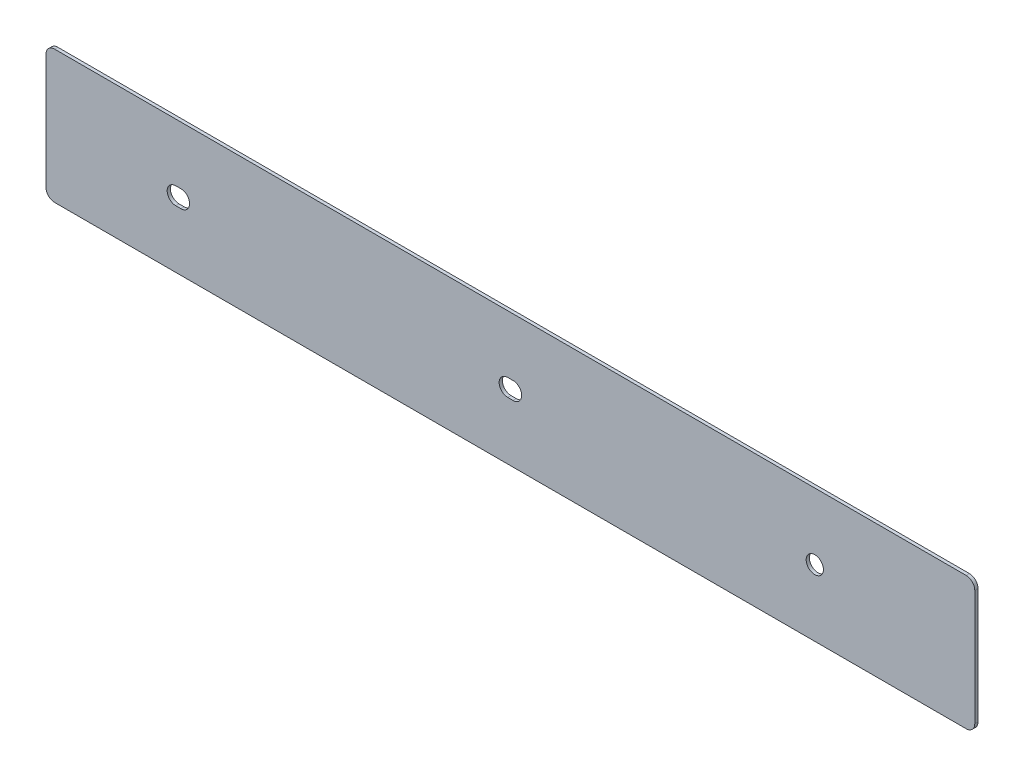
ISO-10303-21;
HEADER;
FILE_DESCRIPTION(('STEP AP214'),'2;1');
FILE_NAME('part.step','',(''),(''),'','','');
FILE_SCHEMA(('AUTOMOTIVE_DESIGN { 1 0 10303 214 1 1 1 1 }'));
ENDSEC;
DATA;
#1=APPLICATION_CONTEXT('core data for automotive mechanical design processes');
#2=APPLICATION_PROTOCOL_DEFINITION('international standard','automotive_design',2000,#1);
#3=PRODUCT_CONTEXT('',#1,'mechanical');
#4=PRODUCT('Part','Part','',(#3));
#5=PRODUCT_RELATED_PRODUCT_CATEGORY('part','',(#4));
#6=PRODUCT_DEFINITION_FORMATION('','',#4);
#7=PRODUCT_DEFINITION_CONTEXT('part definition',#1,'design');
#8=PRODUCT_DEFINITION('design','',#6,#7);
#9=PRODUCT_DEFINITION_SHAPE('','',#8);
#10=(LENGTH_UNIT() NAMED_UNIT(*) SI_UNIT(.MILLI.,.METRE.));
#11=(NAMED_UNIT(*) PLANE_ANGLE_UNIT() SI_UNIT($,.RADIAN.));
#12=(NAMED_UNIT(*) SI_UNIT($,.STERADIAN.) SOLID_ANGLE_UNIT());
#13=UNCERTAINTY_MEASURE_WITH_UNIT(LENGTH_MEASURE(1.E-05),#10,'distance_accuracy_value','');
#14=(GEOMETRIC_REPRESENTATION_CONTEXT(3) GLOBAL_UNCERTAINTY_ASSIGNED_CONTEXT((#13)) GLOBAL_UNIT_ASSIGNED_CONTEXT((#10,
#11,#12)) REPRESENTATION_CONTEXT('',''));
#15=CARTESIAN_POINT('',(0.,0.,0.));
#16=DIRECTION('',(0.,0.,1.));
#17=DIRECTION('',(1.,0.,0.));
#18=AXIS2_PLACEMENT_3D('',#15,#16,#17);
#19=CARTESIAN_POINT('',(0.,0.,-11.92));
#20=DIRECTION('',(0.,0.,1.));
#21=DIRECTION('',(1.,0.,0.));
#22=AXIS2_PLACEMENT_3D('',#19,#20,#21);
#23=PLANE('',#22);
#24=CARTESIAN_POINT('',(-0.3,0.,-11.92));
#25=DIRECTION('',(0.,0.,1.));
#26=DIRECTION('',(1.,0.,0.));
#27=AXIS2_PLACEMENT_3D('',#24,#25,#26);
#28=CIRCLE('',#27,1.);
#29=CARTESIAN_POINT('',(-0.300000000011674,-1.,-11.92));
#30=VERTEX_POINT('',#29);
#31=CARTESIAN_POINT('',(-0.3,1.,-11.92));
#32=VERTEX_POINT('',#31);
#33=EDGE_CURVE('E152',#30,#32,#28,.F.);
#34=ORIENTED_EDGE('',*,*,#33,.T.);
#35=DIRECTION('',(1.,0.,0.));
#36=VECTOR('',#35,1.);
#37=CARTESIAN_POINT('',(-0.3,1.,-11.92));
#38=LINE('',#37,#36);
#39=CARTESIAN_POINT('',(0.426474957438373,1.00000000000013,-11.92));
#40=VERTEX_POINT('',#39);
#41=EDGE_CURVE('E154',#40,#32,#38,.F.);
#42=ORIENTED_EDGE('',*,*,#41,.F.);
#43=CARTESIAN_POINT('',(0.3,0.,-11.92));
#44=DIRECTION('',(0.,0.,1.));
#45=DIRECTION('',(1.,0.,0.));
#46=AXIS2_PLACEMENT_3D('',#43,#44,#45);
#47=CIRCLE('',#46,1.007966227043);
#48=CARTESIAN_POINT('',(0.299999999999996,-1.007966227043,-11.92));
#49=VERTEX_POINT('',#48);
#50=EDGE_CURVE('E156',#40,#49,#47,.F.);
#51=ORIENTED_EDGE('',*,*,#50,.T.);
#52=DIRECTION('',(-0.999911871688358,0.0132758749875694,0.));
#53=VECTOR('',#52,1.);
#54=CARTESIAN_POINT('',(0.3,-1.007966227043,-11.92));
#55=LINE('',#54,#53);
#56=EDGE_CURVE('E149',#30,#49,#55,.F.);
#57=ORIENTED_EDGE('',*,*,#56,.F.);
#58=EDGE_LOOP('',(#34,#42,#51,#57));
#59=FACE_BOUND('',#58,.T.);
#60=CARTESIAN_POINT('',(-38.8,0.,-11.92));
#61=DIRECTION('',(0.,0.,1.));
#62=DIRECTION('',(1.,0.,0.));
#63=AXIS2_PLACEMENT_3D('',#60,#61,#62);
#64=CIRCLE('',#63,1.);
#65=CARTESIAN_POINT('',(-38.8,-1.,-11.92));
#66=VERTEX_POINT('',#65);
#67=CARTESIAN_POINT('',(-38.8,1.,-11.92));
#68=VERTEX_POINT('',#67);
#69=EDGE_CURVE('E161',#66,#68,#64,.F.);
#70=ORIENTED_EDGE('',*,*,#69,.T.);
#71=DIRECTION('',(1.,0.,0.));
#72=VECTOR('',#71,1.);
#73=CARTESIAN_POINT('',(-38.8,1.,-11.92));
#74=LINE('',#73,#72);
#75=CARTESIAN_POINT('',(-38.2,1.,-11.92));
#76=VERTEX_POINT('',#75);
#77=EDGE_CURVE('E163',#76,#68,#74,.F.);
#78=ORIENTED_EDGE('',*,*,#77,.F.);
#79=CARTESIAN_POINT('',(-38.2,0.,-11.92));
#80=DIRECTION('',(0.,0.,1.));
#81=DIRECTION('',(1.,0.,0.));
#82=AXIS2_PLACEMENT_3D('',#79,#80,#81);
#83=CIRCLE('',#82,1.);
#84=CARTESIAN_POINT('',(-38.2,-1.,-11.92));
#85=VERTEX_POINT('',#84);
#86=EDGE_CURVE('E165',#76,#85,#83,.F.);
#87=ORIENTED_EDGE('',*,*,#86,.T.);
#88=DIRECTION('',(1.,0.,0.));
#89=VECTOR('',#88,1.);
#90=CARTESIAN_POINT('',(-38.2,-1.,-11.92));
#91=LINE('',#90,#89);
#92=EDGE_CURVE('E158',#66,#85,#91,.T.);
#93=ORIENTED_EDGE('',*,*,#92,.F.);
#94=EDGE_LOOP('',(#70,#78,#87,#93));
#95=FACE_BOUND('',#94,.T.);
#96=CARTESIAN_POINT('',(35.3,0.,-11.92));
#97=DIRECTION('',(0.,0.,1.));
#98=DIRECTION('',(1.,0.,0.));
#99=AXIS2_PLACEMENT_3D('',#96,#97,#98);
#100=CIRCLE('',#99,1.);
#101=CARTESIAN_POINT('',(36.3,0.,-11.92));
#102=VERTEX_POINT('',#101);
#103=EDGE_CURVE('E166',#102,#102,#100,.F.);
#104=ORIENTED_EDGE('',*,*,#103,.T.);
#105=EDGE_LOOP('',(#104));
#106=FACE_BOUND('',#105,.T.);
#107=DIRECTION('',(0.,1.,0.));
#108=VECTOR('',#107,1.);
#109=CARTESIAN_POINT('',(53.85,-6.7,-11.92));
#110=LINE('',#109,#108);
#111=CARTESIAN_POINT('',(53.85,6.7,-11.92));
#112=VERTEX_POINT('',#111);
#113=CARTESIAN_POINT('',(53.85,-6.7,-11.92));
#114=VERTEX_POINT('',#113);
#115=EDGE_CURVE('E129',#112,#114,#110,.F.);
#116=ORIENTED_EDGE('',*,*,#115,.F.);
#117=CARTESIAN_POINT('',(52.85,6.7,-11.92));
#118=DIRECTION('',(0.,0.,1.));
#119=DIRECTION('',(1.,0.,0.));
#120=AXIS2_PLACEMENT_3D('',#117,#118,#119);
#121=CIRCLE('',#120,1.);
#122=CARTESIAN_POINT('',(52.85,7.7,-11.92));
#123=VERTEX_POINT('',#122);
#124=EDGE_CURVE('E20',#123,#112,#121,.F.);
#125=ORIENTED_EDGE('',*,*,#124,.F.);
#126=DIRECTION('',(1.,0.,0.));
#127=VECTOR('',#126,1.);
#128=CARTESIAN_POINT('',(52.85,7.7,-11.92));
#129=LINE('',#128,#127);
#130=CARTESIAN_POINT('',(-52.85,7.7,-11.92));
#131=VERTEX_POINT('',#130);
#132=EDGE_CURVE('E126',#131,#123,#129,.T.);
#133=ORIENTED_EDGE('',*,*,#132,.F.);
#134=CARTESIAN_POINT('',(-52.85,6.7,-11.92));
#135=DIRECTION('',(0.,0.,1.));
#136=DIRECTION('',(1.,0.,0.));
#137=AXIS2_PLACEMENT_3D('',#134,#135,#136);
#138=CIRCLE('',#137,1.);
#139=CARTESIAN_POINT('',(-53.85,6.7,-11.92));
#140=VERTEX_POINT('',#139);
#141=EDGE_CURVE('E223',#140,#131,#138,.F.);
#142=ORIENTED_EDGE('',*,*,#141,.F.);
#143=DIRECTION('',(0.,1.,0.));
#144=VECTOR('',#143,1.);
#145=CARTESIAN_POINT('',(-53.85,6.7,-11.92));
#146=LINE('',#145,#144);
#147=CARTESIAN_POINT('',(-53.85,-6.7,-11.92));
#148=VERTEX_POINT('',#147);
#149=EDGE_CURVE('E174',#148,#140,#146,.T.);
#150=ORIENTED_EDGE('',*,*,#149,.F.);
#151=CARTESIAN_POINT('',(-52.85,-6.7,-11.92));
#152=DIRECTION('',(0.,0.,1.));
#153=DIRECTION('',(1.,0.,0.));
#154=AXIS2_PLACEMENT_3D('',#151,#152,#153);
#155=CIRCLE('',#154,1.);
#156=CARTESIAN_POINT('',(-52.85,-7.7,-11.92));
#157=VERTEX_POINT('',#156);
#158=EDGE_CURVE('E221',#157,#148,#155,.F.);
#159=ORIENTED_EDGE('',*,*,#158,.F.);
#160=DIRECTION('',(1.,0.,0.));
#161=VECTOR('',#160,1.);
#162=CARTESIAN_POINT('',(-52.85,-7.7,-11.92));
#163=LINE('',#162,#161);
#164=CARTESIAN_POINT('',(52.85,-7.7,-11.92));
#165=VERTEX_POINT('',#164);
#166=EDGE_CURVE('E169',#165,#157,#163,.F.);
#167=ORIENTED_EDGE('',*,*,#166,.F.);
#168=CARTESIAN_POINT('',(52.85,-6.7,-11.92));
#169=DIRECTION('',(0.,0.,1.));
#170=DIRECTION('',(1.,0.,0.));
#171=AXIS2_PLACEMENT_3D('',#168,#169,#170);
#172=CIRCLE('',#171,1.);
#173=EDGE_CURVE('E217',#114,#165,#172,.F.);
#174=ORIENTED_EDGE('',*,*,#173,.F.);
#175=EDGE_LOOP('',(#116,#125,#133,#142,#150,#159,#167,#174));
#176=FACE_BOUND('',#175,.T.);
#177=ADVANCED_FACE('F17',(#59,#95,#106,#176),#23,.T.);
#178=CARTESIAN_POINT('',(52.85,6.7,-11.92));
#179=DIRECTION('',(0.,0.,1.));
#180=DIRECTION('',(1.,0.,0.));
#181=AXIS2_PLACEMENT_3D('',#178,#179,#180);
#182=CYLINDRICAL_SURFACE('',#181,1.);
#183=DIRECTION('',(0.,0.,1.));
#184=VECTOR('',#183,1.);
#185=CARTESIAN_POINT('',(52.85,7.7,-11.92));
#186=LINE('',#185,#184);
#187=CARTESIAN_POINT('',(52.85,7.7,-12.295));
#188=VERTEX_POINT('',#187);
#189=EDGE_CURVE('E134',#123,#188,#186,.F.);
#190=ORIENTED_EDGE('',*,*,#189,.F.);
#191=ORIENTED_EDGE('',*,*,#124,.T.);
#192=DIRECTION('',(0.,0.,-1.));
#193=VECTOR('',#192,1.);
#194=CARTESIAN_POINT('',(53.85,6.7,-11.92));
#195=LINE('',#194,#193);
#196=CARTESIAN_POINT('',(53.85,6.7,-12.295));
#197=VERTEX_POINT('',#196);
#198=EDGE_CURVE('E168',#197,#112,#195,.F.);
#199=ORIENTED_EDGE('',*,*,#198,.F.);
#200=CARTESIAN_POINT('',(52.85,6.7,-12.295));
#201=DIRECTION('',(0.,0.,1.));
#202=DIRECTION('',(1.,0.,0.));
#203=AXIS2_PLACEMENT_3D('',#200,#201,#202);
#204=CIRCLE('',#203,1.);
#205=EDGE_CURVE('E144',#197,#188,#204,.T.);
#206=ORIENTED_EDGE('',*,*,#205,.T.);
#207=EDGE_LOOP('',(#190,#191,#199,#206));
#208=FACE_BOUND('',#207,.T.);
#209=ADVANCED_FACE('F143',(#208),#182,.T.);
#210=CARTESIAN_POINT('',(52.85,7.7,-11.92));
#211=DIRECTION('',(0.,1.,0.));
#212=DIRECTION('',(0.,0.,1.));
#213=AXIS2_PLACEMENT_3D('',#210,#211,#212);
#214=PLANE('',#213);
#215=DIRECTION('',(0.,0.,1.));
#216=VECTOR('',#215,1.);
#217=CARTESIAN_POINT('',(-52.85,7.7,-11.92));
#218=LINE('',#217,#216);
#219=CARTESIAN_POINT('',(-52.85,7.7,-12.295));
#220=VERTEX_POINT('',#219);
#221=EDGE_CURVE('E140',#131,#220,#218,.F.);
#222=ORIENTED_EDGE('',*,*,#221,.F.);
#223=ORIENTED_EDGE('',*,*,#132,.T.);
#224=ORIENTED_EDGE('',*,*,#189,.T.);
#225=DIRECTION('',(1.,0.,0.));
#226=VECTOR('',#225,1.);
#227=CARTESIAN_POINT('',(0.,7.7,-12.295));
#228=LINE('',#227,#226);
#229=EDGE_CURVE('E203',#188,#220,#228,.F.);
#230=ORIENTED_EDGE('',*,*,#229,.T.);
#231=EDGE_LOOP('',(#222,#223,#224,#230));
#232=FACE_BOUND('',#231,.T.);
#233=ADVANCED_FACE('F137',(#232),#214,.T.);
#234=CARTESIAN_POINT('',(-52.85,6.7,-11.92));
#235=DIRECTION('',(0.,0.,1.));
#236=DIRECTION('',(1.,0.,0.));
#237=AXIS2_PLACEMENT_3D('',#234,#235,#236);
#238=CYLINDRICAL_SURFACE('',#237,1.);
#239=DIRECTION('',(0.,0.,1.));
#240=VECTOR('',#239,1.);
#241=CARTESIAN_POINT('',(-53.85,6.7,-11.92));
#242=LINE('',#241,#240);
#243=CARTESIAN_POINT('',(-53.85,6.7,-12.295));
#244=VERTEX_POINT('',#243);
#245=EDGE_CURVE('E177',#140,#244,#242,.F.);
#246=ORIENTED_EDGE('',*,*,#245,.F.);
#247=ORIENTED_EDGE('',*,*,#141,.T.);
#248=ORIENTED_EDGE('',*,*,#221,.T.);
#249=CARTESIAN_POINT('',(-52.85,6.7,-12.295));
#250=DIRECTION('',(0.,0.,1.));
#251=DIRECTION('',(1.,0.,0.));
#252=AXIS2_PLACEMENT_3D('',#249,#250,#251);
#253=CIRCLE('',#252,1.);
#254=EDGE_CURVE('E200',#220,#244,#253,.T.);
#255=ORIENTED_EDGE('',*,*,#254,.T.);
#256=EDGE_LOOP('',(#246,#247,#248,#255));
#257=FACE_BOUND('',#256,.T.);
#258=ADVANCED_FACE('F227',(#257),#238,.T.);
#259=CARTESIAN_POINT('',(-53.85,6.7,-11.92));
#260=DIRECTION('',(-1.,0.,0.));
#261=DIRECTION('',(0.,0.,1.));
#262=AXIS2_PLACEMENT_3D('',#259,#260,#261);
#263=PLANE('',#262);
#264=DIRECTION('',(0.,0.,1.));
#265=VECTOR('',#264,1.);
#266=CARTESIAN_POINT('',(-53.85,-6.7,-11.92));
#267=LINE('',#266,#265);
#268=CARTESIAN_POINT('',(-53.85,-6.7,-12.295));
#269=VERTEX_POINT('',#268);
#270=EDGE_CURVE('E176',#148,#269,#267,.F.);
#271=ORIENTED_EDGE('',*,*,#270,.F.);
#272=ORIENTED_EDGE('',*,*,#149,.T.);
#273=ORIENTED_EDGE('',*,*,#245,.T.);
#274=DIRECTION('',(0.,1.,0.));
#275=VECTOR('',#274,1.);
#276=CARTESIAN_POINT('',(-53.85,0.,-12.295));
#277=LINE('',#276,#275);
#278=EDGE_CURVE('E199',#244,#269,#277,.F.);
#279=ORIENTED_EDGE('',*,*,#278,.T.);
#280=EDGE_LOOP('',(#271,#272,#273,#279));
#281=FACE_BOUND('',#280,.T.);
#282=ADVANCED_FACE('F264',(#281),#263,.T.);
#283=CARTESIAN_POINT('',(-52.85,-6.7,-11.92));
#284=DIRECTION('',(0.,0.,1.));
#285=DIRECTION('',(1.,0.,0.));
#286=AXIS2_PLACEMENT_3D('',#283,#284,#285);
#287=CYLINDRICAL_SURFACE('',#286,1.);
#288=DIRECTION('',(0.,0.,-1.));
#289=VECTOR('',#288,1.);
#290=CARTESIAN_POINT('',(-52.85,-7.7,-11.92));
#291=LINE('',#290,#289);
#292=CARTESIAN_POINT('',(-52.85,-7.7,-12.295));
#293=VERTEX_POINT('',#292);
#294=EDGE_CURVE('E173',#157,#293,#291,.T.);
#295=ORIENTED_EDGE('',*,*,#294,.F.);
#296=ORIENTED_EDGE('',*,*,#158,.T.);
#297=ORIENTED_EDGE('',*,*,#270,.T.);
#298=CARTESIAN_POINT('',(-52.85,-6.7,-12.295));
#299=DIRECTION('',(0.,0.,1.));
#300=DIRECTION('',(1.,0.,0.));
#301=AXIS2_PLACEMENT_3D('',#298,#299,#300);
#302=CIRCLE('',#301,1.);
#303=EDGE_CURVE('E196',#269,#293,#302,.T.);
#304=ORIENTED_EDGE('',*,*,#303,.T.);
#305=EDGE_LOOP('',(#295,#296,#297,#304));
#306=FACE_BOUND('',#305,.T.);
#307=ADVANCED_FACE('F260',(#306),#287,.T.);
#308=CARTESIAN_POINT('',(-52.85,-7.7,-11.92));
#309=DIRECTION('',(0.,-1.,0.));
#310=DIRECTION('',(0.,0.,-1.));
#311=AXIS2_PLACEMENT_3D('',#308,#309,#310);
#312=PLANE('',#311);
#313=DIRECTION('',(0.,0.,1.));
#314=VECTOR('',#313,1.);
#315=CARTESIAN_POINT('',(52.85,-7.7,-11.92));
#316=LINE('',#315,#314);
#317=CARTESIAN_POINT('',(52.85,-7.7,-12.295));
#318=VERTEX_POINT('',#317);
#319=EDGE_CURVE('E172',#165,#318,#316,.F.);
#320=ORIENTED_EDGE('',*,*,#319,.F.);
#321=ORIENTED_EDGE('',*,*,#166,.T.);
#322=ORIENTED_EDGE('',*,*,#294,.T.);
#323=DIRECTION('',(1.,0.,0.));
#324=VECTOR('',#323,1.);
#325=CARTESIAN_POINT('',(0.,-7.7,-12.295));
#326=LINE('',#325,#324);
#327=EDGE_CURVE('E195',#293,#318,#326,.T.);
#328=ORIENTED_EDGE('',*,*,#327,.T.);
#329=EDGE_LOOP('',(#320,#321,#322,#328));
#330=FACE_BOUND('',#329,.T.);
#331=ADVANCED_FACE('F267',(#330),#312,.T.);
#332=CARTESIAN_POINT('',(52.85,-6.7,-11.92));
#333=DIRECTION('',(0.,0.,1.));
#334=DIRECTION('',(1.,0.,0.));
#335=AXIS2_PLACEMENT_3D('',#332,#333,#334);
#336=CYLINDRICAL_SURFACE('',#335,1.);
#337=DIRECTION('',(0.,0.,-1.));
#338=VECTOR('',#337,1.);
#339=CARTESIAN_POINT('',(53.85,-6.7,-11.92));
#340=LINE('',#339,#338);
#341=CARTESIAN_POINT('',(53.85,-6.7,-12.295));
#342=VERTEX_POINT('',#341);
#343=EDGE_CURVE('E220',#114,#342,#340,.T.);
#344=ORIENTED_EDGE('',*,*,#343,.F.);
#345=ORIENTED_EDGE('',*,*,#173,.T.);
#346=ORIENTED_EDGE('',*,*,#319,.T.);
#347=CARTESIAN_POINT('',(52.85,-6.7,-12.295));
#348=DIRECTION('',(0.,0.,1.));
#349=DIRECTION('',(1.,0.,0.));
#350=AXIS2_PLACEMENT_3D('',#347,#348,#349);
#351=CIRCLE('',#350,1.);
#352=EDGE_CURVE('E192',#318,#342,#351,.T.);
#353=ORIENTED_EDGE('',*,*,#352,.T.);
#354=EDGE_LOOP('',(#344,#345,#346,#353));
#355=FACE_BOUND('',#354,.T.);
#356=ADVANCED_FACE('F270',(#355),#336,.T.);
#357=CARTESIAN_POINT('',(53.85,-6.7,-11.92));
#358=DIRECTION('',(1.,0.,0.));
#359=DIRECTION('',(0.,0.,-1.));
#360=AXIS2_PLACEMENT_3D('',#357,#358,#359);
#361=PLANE('',#360);
#362=ORIENTED_EDGE('',*,*,#198,.T.);
#363=ORIENTED_EDGE('',*,*,#115,.T.);
#364=ORIENTED_EDGE('',*,*,#343,.T.);
#365=DIRECTION('',(0.,1.,0.));
#366=VECTOR('',#365,1.);
#367=CARTESIAN_POINT('',(53.85,0.,-12.295));
#368=LINE('',#367,#366);
#369=EDGE_CURVE('E191',#342,#197,#368,.T.);
#370=ORIENTED_EDGE('',*,*,#369,.T.);
#371=EDGE_LOOP('',(#362,#363,#364,#370));
#372=FACE_BOUND('',#371,.T.);
#373=ADVANCED_FACE('F392',(#372),#361,.T.);
#374=CARTESIAN_POINT('',(35.3,0.,-11.92));
#375=DIRECTION('',(0.,0.,1.));
#376=DIRECTION('',(1.,0.,0.));
#377=AXIS2_PLACEMENT_3D('',#374,#375,#376);
#378=CYLINDRICAL_SURFACE('',#377,1.);
#379=CARTESIAN_POINT('',(35.3,0.,-12.295));
#380=DIRECTION('',(0.,0.,1.));
#381=DIRECTION('',(1.,0.,0.));
#382=AXIS2_PLACEMENT_3D('',#379,#380,#381);
#383=CIRCLE('',#382,1.);
#384=CARTESIAN_POINT('',(36.3,0.,-12.295));
#385=VERTEX_POINT('',#384);
#386=EDGE_CURVE('E188',#385,#385,#383,.F.);
#387=ORIENTED_EDGE('',*,*,#386,.T.);
#388=EDGE_LOOP('',(#387));
#389=FACE_BOUND('',#388,.T.);
#390=ORIENTED_EDGE('',*,*,#103,.F.);
#391=EDGE_LOOP('',(#390));
#392=FACE_BOUND('',#391,.T.);
#393=ADVANCED_FACE('F383',(#389,#392),#378,.F.);
#394=CARTESIAN_POINT('',(-38.8,1.,-11.92));
#395=DIRECTION('',(0.,-1.,0.));
#396=DIRECTION('',(0.,0.,-1.));
#397=AXIS2_PLACEMENT_3D('',#394,#395,#396);
#398=PLANE('',#397);
#399=DIRECTION('',(0.,0.,1.));
#400=VECTOR('',#399,1.);
#401=CARTESIAN_POINT('',(-38.2,1.,-11.92));
#402=LINE('',#401,#400);
#403=CARTESIAN_POINT('',(-38.2,1.,-12.295));
#404=VERTEX_POINT('',#403);
#405=EDGE_CURVE('E214',#404,#76,#402,.T.);
#406=ORIENTED_EDGE('',*,*,#405,.T.);
#407=ORIENTED_EDGE('',*,*,#77,.T.);
#408=DIRECTION('',(0.,0.,1.));
#409=VECTOR('',#408,1.);
#410=CARTESIAN_POINT('',(-38.8,1.,-11.92));
#411=LINE('',#410,#409);
#412=CARTESIAN_POINT('',(-38.8,1.,-12.295));
#413=VERTEX_POINT('',#412);
#414=EDGE_CURVE('E212',#68,#413,#411,.F.);
#415=ORIENTED_EDGE('',*,*,#414,.T.);
#416=DIRECTION('',(1.,0.,0.));
#417=VECTOR('',#416,1.);
#418=CARTESIAN_POINT('',(0.,1.,-12.295));
#419=LINE('',#418,#417);
#420=EDGE_CURVE('E187',#413,#404,#419,.T.);
#421=ORIENTED_EDGE('',*,*,#420,.T.);
#422=EDGE_LOOP('',(#406,#407,#415,#421));
#423=FACE_BOUND('',#422,.T.);
#424=ADVANCED_FACE('F374',(#423),#398,.T.);
#425=CARTESIAN_POINT('',(-38.2,0.,-11.92));
#426=DIRECTION('',(0.,0.,1.));
#427=DIRECTION('',(1.,0.,0.));
#428=AXIS2_PLACEMENT_3D('',#425,#426,#427);
#429=CYLINDRICAL_SURFACE('',#428,1.);
#430=CARTESIAN_POINT('',(-38.2,0.,-12.295));
#431=DIRECTION('',(0.,0.,1.));
#432=DIRECTION('',(1.,0.,0.));
#433=AXIS2_PLACEMENT_3D('',#430,#431,#432);
#434=CIRCLE('',#433,1.);
#435=CARTESIAN_POINT('',(-38.2,-1.,-12.295));
#436=VERTEX_POINT('',#435);
#437=EDGE_CURVE('E185',#404,#436,#434,.F.);
#438=ORIENTED_EDGE('',*,*,#437,.T.);
#439=DIRECTION('',(0.,0.,1.));
#440=VECTOR('',#439,1.);
#441=CARTESIAN_POINT('',(-38.2,-1.,-11.92));
#442=LINE('',#441,#440);
#443=EDGE_CURVE('E162',#85,#436,#442,.F.);
#444=ORIENTED_EDGE('',*,*,#443,.F.);
#445=ORIENTED_EDGE('',*,*,#86,.F.);
#446=ORIENTED_EDGE('',*,*,#405,.F.);
#447=EDGE_LOOP('',(#438,#444,#445,#446));
#448=FACE_BOUND('',#447,.T.);
#449=ADVANCED_FACE('F365',(#448),#429,.F.);
#450=CARTESIAN_POINT('',(-38.2,-1.,-11.92));
#451=DIRECTION('',(0.,1.,0.));
#452=DIRECTION('',(0.,0.,1.));
#453=AXIS2_PLACEMENT_3D('',#450,#451,#452);
#454=PLANE('',#453);
#455=DIRECTION('',(0.,0.,1.));
#456=VECTOR('',#455,1.);
#457=CARTESIAN_POINT('',(-38.8,-1.,-11.92));
#458=LINE('',#457,#456);
#459=CARTESIAN_POINT('',(-38.8,-1.,-12.295));
#460=VERTEX_POINT('',#459);
#461=EDGE_CURVE('E157',#460,#66,#458,.T.);
#462=ORIENTED_EDGE('',*,*,#461,.T.);
#463=ORIENTED_EDGE('',*,*,#92,.T.);
#464=ORIENTED_EDGE('',*,*,#443,.T.);
#465=DIRECTION('',(1.,0.,0.));
#466=VECTOR('',#465,1.);
#467=CARTESIAN_POINT('',(0.,-1.,-12.295));
#468=LINE('',#467,#466);
#469=EDGE_CURVE('E184',#436,#460,#468,.F.);
#470=ORIENTED_EDGE('',*,*,#469,.T.);
#471=EDGE_LOOP('',(#462,#463,#464,#470));
#472=FACE_BOUND('',#471,.T.);
#473=ADVANCED_FACE('F310',(#472),#454,.T.);
#474=CARTESIAN_POINT('',(-38.8,0.,-11.92));
#475=DIRECTION('',(0.,0.,1.));
#476=DIRECTION('',(1.,0.,0.));
#477=AXIS2_PLACEMENT_3D('',#474,#475,#476);
#478=CYLINDRICAL_SURFACE('',#477,1.);
#479=CARTESIAN_POINT('',(-38.8,0.,-12.295));
#480=DIRECTION('',(0.,0.,1.));
#481=DIRECTION('',(1.,0.,0.));
#482=AXIS2_PLACEMENT_3D('',#479,#480,#481);
#483=CIRCLE('',#482,1.);
#484=EDGE_CURVE('E182',#460,#413,#483,.F.);
#485=ORIENTED_EDGE('',*,*,#484,.T.);
#486=ORIENTED_EDGE('',*,*,#414,.F.);
#487=ORIENTED_EDGE('',*,*,#69,.F.);
#488=ORIENTED_EDGE('',*,*,#461,.F.);
#489=EDGE_LOOP('',(#485,#486,#487,#488));
#490=FACE_BOUND('',#489,.T.);
#491=ADVANCED_FACE('F302',(#490),#478,.F.);
#492=CARTESIAN_POINT('',(-0.3,1.,-11.92));
#493=DIRECTION('',(0.,-1.,0.));
#494=DIRECTION('',(0.,0.,-1.));
#495=AXIS2_PLACEMENT_3D('',#492,#493,#494);
#496=PLANE('',#495);
#497=DIRECTION('',(0.,0.,1.));
#498=VECTOR('',#497,1.);
#499=CARTESIAN_POINT('',(0.426474957437333,1.00000000000026,-11.92));
#500=LINE('',#499,#498);
#501=CARTESIAN_POINT('',(0.426474957438373,1.00000000000013,-12.295));
#502=VERTEX_POINT('',#501);
#503=EDGE_CURVE('E209',#502,#40,#500,.T.);
#504=ORIENTED_EDGE('',*,*,#503,.T.);
#505=ORIENTED_EDGE('',*,*,#41,.T.);
#506=DIRECTION('',(0.,0.,1.));
#507=VECTOR('',#506,1.);
#508=CARTESIAN_POINT('',(-0.3,1.,-11.92));
#509=LINE('',#508,#507);
#510=CARTESIAN_POINT('',(-0.3,1.,-12.295));
#511=VERTEX_POINT('',#510);
#512=EDGE_CURVE('E207',#32,#511,#509,.F.);
#513=ORIENTED_EDGE('',*,*,#512,.T.);
#514=DIRECTION('',(1.,0.,0.));
#515=VECTOR('',#514,1.);
#516=CARTESIAN_POINT('',(0.,1.,-12.295));
#517=LINE('',#516,#515);
#518=EDGE_CURVE('E181',#511,#502,#517,.T.);
#519=ORIENTED_EDGE('',*,*,#518,.T.);
#520=EDGE_LOOP('',(#504,#505,#513,#519));
#521=FACE_BOUND('',#520,.T.);
#522=ADVANCED_FACE('F300',(#521),#496,.T.);
#523=CARTESIAN_POINT('',(0.3,0.,-11.92));
#524=DIRECTION('',(0.,0.,1.));
#525=DIRECTION('',(1.,0.,0.));
#526=AXIS2_PLACEMENT_3D('',#523,#524,#525);
#527=CYLINDRICAL_SURFACE('',#526,1.007966227043);
#528=CARTESIAN_POINT('',(0.3,0.,-12.295));
#529=DIRECTION('',(0.,0.,1.));
#530=DIRECTION('',(1.,0.,0.));
#531=AXIS2_PLACEMENT_3D('',#528,#529,#530);
#532=CIRCLE('',#531,1.007966227043);
#533=CARTESIAN_POINT('',(0.299999999999997,-1.007966227043,-12.295));
#534=VERTEX_POINT('',#533);
#535=EDGE_CURVE('E179',#502,#534,#532,.F.);
#536=ORIENTED_EDGE('',*,*,#535,.T.);
#537=DIRECTION('',(0.,0.,1.));
#538=VECTOR('',#537,1.);
#539=CARTESIAN_POINT('',(0.3,-1.007966227043,-11.92));
#540=LINE('',#539,#538);
#541=EDGE_CURVE('E153',#49,#534,#540,.F.);
#542=ORIENTED_EDGE('',*,*,#541,.F.);
#543=ORIENTED_EDGE('',*,*,#50,.F.);
#544=ORIENTED_EDGE('',*,*,#503,.F.);
#545=EDGE_LOOP('',(#536,#542,#543,#544));
#546=FACE_BOUND('',#545,.T.);
#547=ADVANCED_FACE('F299',(#546),#527,.F.);
#548=CARTESIAN_POINT('',(0.3,-1.007966227043,-11.92));
#549=DIRECTION('',(0.0132758749875694,0.999911871688358,0.));
#550=DIRECTION('',(-0.999911871688358,0.0132758749875694,0.));
#551=AXIS2_PLACEMENT_3D('',#548,#549,#550);
#552=PLANE('',#551);
#553=DIRECTION('',(0.,0.,1.));
#554=VECTOR('',#553,1.);
#555=CARTESIAN_POINT('',(-0.2999999999993,-1.,-11.92));
#556=LINE('',#555,#554);
#557=CARTESIAN_POINT('',(-0.299999999999306,-1.,-12.295));
#558=VERTEX_POINT('',#557);
#559=EDGE_CURVE('E34',#558,#30,#556,.T.);
#560=ORIENTED_EDGE('',*,*,#559,.T.);
#561=ORIENTED_EDGE('',*,*,#56,.T.);
#562=ORIENTED_EDGE('',*,*,#541,.T.);
#563=DIRECTION('',(-0.99991187168835,0.0132758749881166,0.));
#564=VECTOR('',#563,1.);
#565=CARTESIAN_POINT('',(0.3,-1.007966227043,-12.295));
#566=LINE('',#565,#564);
#567=EDGE_CURVE('E26',#534,#558,#566,.T.);
#568=ORIENTED_EDGE('',*,*,#567,.T.);
#569=EDGE_LOOP('',(#560,#561,#562,#568));
#570=FACE_BOUND('',#569,.T.);
#571=ADVANCED_FACE('F285',(#570),#552,.T.);
#572=CARTESIAN_POINT('',(-0.3,0.,-11.92));
#573=DIRECTION('',(0.,0.,1.));
#574=DIRECTION('',(1.,0.,0.));
#575=AXIS2_PLACEMENT_3D('',#572,#573,#574);
#576=CYLINDRICAL_SURFACE('',#575,1.);
#577=CARTESIAN_POINT('',(-0.3,0.,-12.295));
#578=DIRECTION('',(0.,0.,1.));
#579=DIRECTION('',(1.,0.,0.));
#580=AXIS2_PLACEMENT_3D('',#577,#578,#579);
#581=CIRCLE('',#580,1.);
#582=EDGE_CURVE('E11',#558,#511,#581,.F.);
#583=ORIENTED_EDGE('',*,*,#582,.T.);
#584=ORIENTED_EDGE('',*,*,#512,.F.);
#585=ORIENTED_EDGE('',*,*,#33,.F.);
#586=ORIENTED_EDGE('',*,*,#559,.F.);
#587=EDGE_LOOP('',(#583,#584,#585,#586));
#588=FACE_BOUND('',#587,.T.);
#589=ADVANCED_FACE('F292',(#588),#576,.F.);
#590=CARTESIAN_POINT('',(0.,0.,-12.295));
#591=DIRECTION('',(0.,0.,1.));
#592=DIRECTION('',(1.,0.,0.));
#593=AXIS2_PLACEMENT_3D('',#590,#591,#592);
#594=PLANE('',#593);
#595=ORIENTED_EDGE('',*,*,#582,.F.);
#596=ORIENTED_EDGE('',*,*,#567,.F.);
#597=ORIENTED_EDGE('',*,*,#535,.F.);
#598=ORIENTED_EDGE('',*,*,#518,.F.);
#599=EDGE_LOOP('',(#595,#596,#597,#598));
#600=FACE_BOUND('',#599,.T.);
#601=ORIENTED_EDGE('',*,*,#484,.F.);
#602=ORIENTED_EDGE('',*,*,#469,.F.);
#603=ORIENTED_EDGE('',*,*,#437,.F.);
#604=ORIENTED_EDGE('',*,*,#420,.F.);
#605=EDGE_LOOP('',(#601,#602,#603,#604));
#606=FACE_BOUND('',#605,.T.);
#607=ORIENTED_EDGE('',*,*,#386,.F.);
#608=EDGE_LOOP('',(#607));
#609=FACE_BOUND('',#608,.T.);
#610=ORIENTED_EDGE('',*,*,#352,.F.);
#611=ORIENTED_EDGE('',*,*,#327,.F.);
#612=ORIENTED_EDGE('',*,*,#303,.F.);
#613=ORIENTED_EDGE('',*,*,#278,.F.);
#614=ORIENTED_EDGE('',*,*,#254,.F.);
#615=ORIENTED_EDGE('',*,*,#229,.F.);
#616=ORIENTED_EDGE('',*,*,#205,.F.);
#617=ORIENTED_EDGE('',*,*,#369,.F.);
#618=EDGE_LOOP('',(#610,#611,#612,#613,#614,#615,#616,#617));
#619=FACE_BOUND('',#618,.T.);
#620=ADVANCED_FACE('F231',(#600,#606,#609,#619),#594,.F.);
#621=CLOSED_SHELL('',(#177,#209,#233,#258,#282,#307,#331,#356,#373,#393,#424,#449,#473,#491,
#522,#547,#571,#589,#620));
#622=MANIFOLD_SOLID_BREP('B1',#621);
#623=ADVANCED_BREP_SHAPE_REPRESENTATION('',(#18,#622),#14);
#624=SHAPE_DEFINITION_REPRESENTATION(#9,#623);
ENDSEC;
END-ISO-10303-21;
